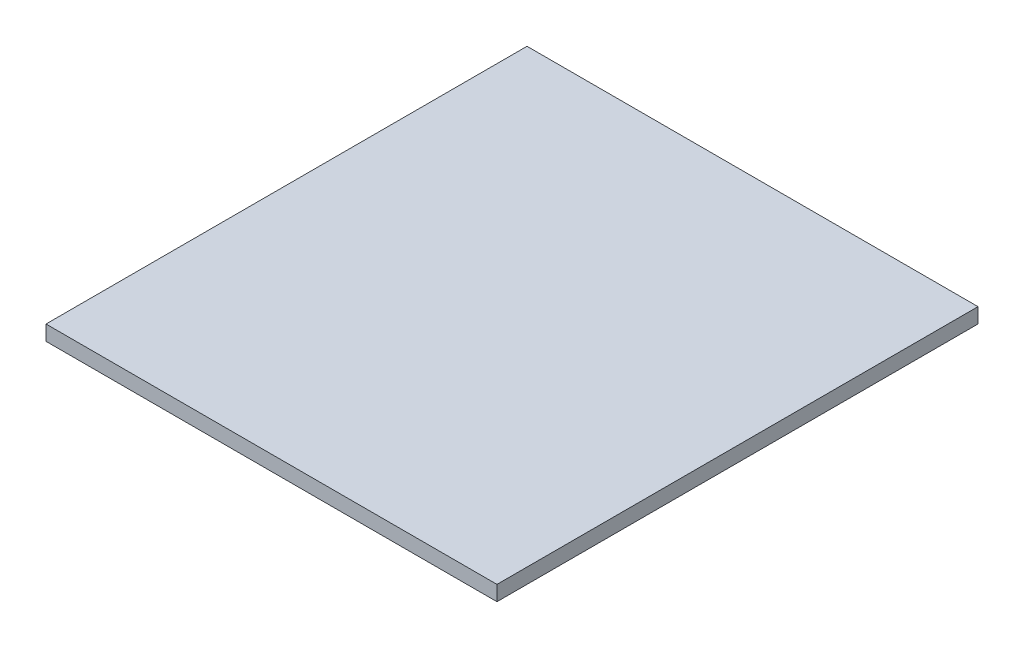
ISO-10303-21;
HEADER;
FILE_DESCRIPTION(('STEP AP214'),'2;1');
FILE_NAME('part.step','',(''),(''),'','','');
FILE_SCHEMA(('AUTOMOTIVE_DESIGN { 1 0 10303 214 1 1 1 1 }'));
ENDSEC;
DATA;
#1=APPLICATION_CONTEXT('core data for automotive mechanical design processes');
#2=APPLICATION_PROTOCOL_DEFINITION('international standard','automotive_design',2000,#1);
#3=PRODUCT_CONTEXT('',#1,'mechanical');
#4=PRODUCT('Part','Part','',(#3));
#5=PRODUCT_RELATED_PRODUCT_CATEGORY('part','',(#4));
#6=PRODUCT_DEFINITION_FORMATION('','',#4);
#7=PRODUCT_DEFINITION_CONTEXT('part definition',#1,'design');
#8=PRODUCT_DEFINITION('design','',#6,#7);
#9=PRODUCT_DEFINITION_SHAPE('','',#8);
#10=(LENGTH_UNIT() NAMED_UNIT(*) SI_UNIT(.MILLI.,.METRE.));
#11=(NAMED_UNIT(*) PLANE_ANGLE_UNIT() SI_UNIT($,.RADIAN.));
#12=(NAMED_UNIT(*) SI_UNIT($,.STERADIAN.) SOLID_ANGLE_UNIT());
#13=UNCERTAINTY_MEASURE_WITH_UNIT(LENGTH_MEASURE(1.E-05),#10,'distance_accuracy_value','');
#14=(GEOMETRIC_REPRESENTATION_CONTEXT(3) GLOBAL_UNCERTAINTY_ASSIGNED_CONTEXT((#13)) GLOBAL_UNIT_ASSIGNED_CONTEXT((#10,
#11,#12)) REPRESENTATION_CONTEXT('',''));
#15=CARTESIAN_POINT('',(0.,0.,0.));
#16=DIRECTION('',(0.,0.,1.));
#17=DIRECTION('',(1.,0.,0.));
#18=AXIS2_PLACEMENT_3D('',#15,#16,#17);
#19=CARTESIAN_POINT('',(0.,0.,0.));
#20=DIRECTION('',(0.,1.,0.));
#21=DIRECTION('',(0.,0.,1.));
#22=AXIS2_PLACEMENT_3D('',#19,#20,#21);
#23=PLANE('',#22);
#24=DIRECTION('',(0.,0.,-1.));
#25=VECTOR('',#24,1.);
#26=CARTESIAN_POINT('',(158.75,0.,-165.1));
#27=LINE('',#26,#25);
#28=CARTESIAN_POINT('',(158.75,0.,165.1));
#29=VERTEX_POINT('',#28);
#30=CARTESIAN_POINT('',(158.75,0.,-165.1));
#31=VERTEX_POINT('',#30);
#32=EDGE_CURVE('E140',#29,#31,#27,.T.);
#33=ORIENTED_EDGE('',*,*,#32,.F.);
#34=DIRECTION('',(1.,0.,0.));
#35=VECTOR('',#34,1.);
#36=CARTESIAN_POINT('',(-158.75,0.,165.1));
#37=LINE('',#36,#35);
#38=CARTESIAN_POINT('',(-158.75,0.,165.1));
#39=VERTEX_POINT('',#38);
#40=EDGE_CURVE('E142',#39,#29,#37,.T.);
#41=ORIENTED_EDGE('',*,*,#40,.F.);
#42=DIRECTION('',(0.,0.,1.));
#43=VECTOR('',#42,1.);
#44=CARTESIAN_POINT('',(-158.75,0.,-165.1));
#45=LINE('',#44,#43);
#46=CARTESIAN_POINT('',(-158.75,0.,-165.1));
#47=VERTEX_POINT('',#46);
#48=EDGE_CURVE('E231',#47,#39,#45,.T.);
#49=ORIENTED_EDGE('',*,*,#48,.F.);
#50=DIRECTION('',(-1.,0.,0.));
#51=VECTOR('',#50,1.);
#52=CARTESIAN_POINT('',(-158.75,0.,-165.1));
#53=LINE('',#52,#51);
#54=EDGE_CURVE('E183',#31,#47,#53,.T.);
#55=ORIENTED_EDGE('',*,*,#54,.F.);
#56=EDGE_LOOP('',(#33,#41,#49,#55));
#57=FACE_BOUND('',#56,.T.);
#58=ADVANCED_FACE('F46',(#57),#23,.F.);
#59=CARTESIAN_POINT('',(152.644230769231,-30.5288461538462,0.));
#60=DIRECTION('',(-0.98058067569092,0.196116135138184,0.));
#61=DIRECTION('',(-0.196116135138184,-0.98058067569092,0.));
#62=AXIS2_PLACEMENT_3D('',#59,#60,#61);
#63=PLANE('',#62);
#64=DIRECTION('',(0.179424521606502,0.897122608032512,-0.403705173614634));
#65=VECTOR('',#64,1.);
#66=CARTESIAN_POINT('',(158.75,0.,-165.1));
#67=LINE('',#66,#65);
#68=CARTESIAN_POINT('',(163.83,25.4,-176.53));
#69=VERTEX_POINT('',#68);
#70=EDGE_CURVE('E63',#31,#69,#67,.T.);
#71=ORIENTED_EDGE('',*,*,#70,.T.);
#72=DIRECTION('',(0.,0.,-1.));
#73=VECTOR('',#72,1.);
#74=CARTESIAN_POINT('',(163.83,25.4,-176.53));
#75=LINE('',#74,#73);
#76=CARTESIAN_POINT('',(163.83,25.4,176.53));
#77=VERTEX_POINT('',#76);
#78=EDGE_CURVE('E285',#77,#69,#75,.T.);
#79=ORIENTED_EDGE('',*,*,#78,.F.);
#80=DIRECTION('',(0.179424521606504,0.897122608032514,0.403705173614628));
#81=VECTOR('',#80,1.);
#82=CARTESIAN_POINT('',(158.75,0.,165.1));
#83=LINE('',#82,#81);
#84=EDGE_CURVE('E292',#29,#77,#83,.T.);
#85=ORIENTED_EDGE('',*,*,#84,.F.);
#86=ORIENTED_EDGE('',*,*,#32,.T.);
#87=EDGE_LOOP('',(#71,#79,#85,#86));
#88=FACE_BOUND('',#87,.T.);
#89=ADVANCED_FACE('F249',(#88),#63,.F.);
#90=CARTESIAN_POINT('',(0.,-61.7837837837835,137.297297297298));
#91=DIRECTION('',(0.,0.410364677328795,-0.911921505175108));
#92=DIRECTION('',(0.,0.911921505175108,0.410364677328795));
#93=AXIS2_PLACEMENT_3D('',#90,#91,#92);
#94=PLANE('',#93);
#95=ORIENTED_EDGE('',*,*,#84,.T.);
#96=DIRECTION('',(1.,0.,0.));
#97=VECTOR('',#96,1.);
#98=CARTESIAN_POINT('',(-163.83,25.4,176.53));
#99=LINE('',#98,#97);
#100=CARTESIAN_POINT('',(-163.83,25.4,176.53));
#101=VERTEX_POINT('',#100);
#102=EDGE_CURVE('E152',#101,#77,#99,.T.);
#103=ORIENTED_EDGE('',*,*,#102,.F.);
#104=DIRECTION('',(-0.179424521606502,0.897122608032514,0.403705173614628));
#105=VECTOR('',#104,1.);
#106=CARTESIAN_POINT('',(-158.75,0.,165.1));
#107=LINE('',#106,#105);
#108=EDGE_CURVE('E288',#39,#101,#107,.T.);
#109=ORIENTED_EDGE('',*,*,#108,.F.);
#110=ORIENTED_EDGE('',*,*,#40,.T.);
#111=EDGE_LOOP('',(#95,#103,#109,#110));
#112=FACE_BOUND('',#111,.T.);
#113=ADVANCED_FACE('F198',(#112),#94,.F.);
#114=CARTESIAN_POINT('',(0.,-61.7837837837841,-137.297297297297));
#115=DIRECTION('',(0.,0.410364677328801,0.911921505175105));
#116=DIRECTION('',(0.,-0.911921505175105,0.410364677328801));
#117=AXIS2_PLACEMENT_3D('',#114,#115,#116);
#118=PLANE('',#117);
#119=DIRECTION('',(-0.179424521606502,0.897122608032512,-0.403705173614634));
#120=VECTOR('',#119,1.);
#121=CARTESIAN_POINT('',(-158.75,0.,-165.1));
#122=LINE('',#121,#120);
#123=CARTESIAN_POINT('',(-163.83,25.4,-176.53));
#124=VERTEX_POINT('',#123);
#125=EDGE_CURVE('E290',#47,#124,#122,.T.);
#126=ORIENTED_EDGE('',*,*,#125,.T.);
#127=DIRECTION('',(-1.,0.,0.));
#128=VECTOR('',#127,1.);
#129=CARTESIAN_POINT('',(-163.83,25.4,-176.53));
#130=LINE('',#129,#128);
#131=EDGE_CURVE('E12',#69,#124,#130,.T.);
#132=ORIENTED_EDGE('',*,*,#131,.F.);
#133=ORIENTED_EDGE('',*,*,#70,.F.);
#134=ORIENTED_EDGE('',*,*,#54,.T.);
#135=EDGE_LOOP('',(#126,#132,#133,#134));
#136=FACE_BOUND('',#135,.T.);
#137=ADVANCED_FACE('F189',(#136),#118,.F.);
#138=CARTESIAN_POINT('',(-152.644230769231,-30.528846153846,0.));
#139=DIRECTION('',(0.98058067569092,0.196116135138183,0.));
#140=DIRECTION('',(-0.196116135138183,0.98058067569092,0.));
#141=AXIS2_PLACEMENT_3D('',#138,#139,#140);
#142=PLANE('',#141);
#143=ORIENTED_EDGE('',*,*,#108,.T.);
#144=DIRECTION('',(0.,0.,1.));
#145=VECTOR('',#144,1.);
#146=CARTESIAN_POINT('',(-163.83,25.4,-176.53));
#147=LINE('',#146,#145);
#148=EDGE_CURVE('E56',#124,#101,#147,.T.);
#149=ORIENTED_EDGE('',*,*,#148,.F.);
#150=ORIENTED_EDGE('',*,*,#125,.F.);
#151=ORIENTED_EDGE('',*,*,#48,.T.);
#152=EDGE_LOOP('',(#143,#149,#150,#151));
#153=FACE_BOUND('',#152,.T.);
#154=ADVANCED_FACE('F48',(#153),#142,.F.);
#155=CARTESIAN_POINT('',(0.,25.4,0.));
#156=DIRECTION('',(0.,1.,0.));
#157=DIRECTION('',(0.,0.,1.));
#158=AXIS2_PLACEMENT_3D('',#155,#156,#157);
#159=PLANE('',#158);
#160=DIRECTION('',(0.,0.,-1.));
#161=VECTOR('',#160,1.);
#162=CARTESIAN_POINT('',(190.5,25.4,-203.2));
#163=LINE('',#162,#161);
#164=CARTESIAN_POINT('',(190.5,25.4,203.2));
#165=VERTEX_POINT('',#164);
#166=CARTESIAN_POINT('',(190.5,25.4,-203.2));
#167=VERTEX_POINT('',#166);
#168=EDGE_CURVE('E139',#165,#167,#163,.T.);
#169=ORIENTED_EDGE('',*,*,#168,.F.);
#170=DIRECTION('',(1.,0.,0.));
#171=VECTOR('',#170,1.);
#172=CARTESIAN_POINT('',(-190.5,25.4,203.2));
#173=LINE('',#172,#171);
#174=CARTESIAN_POINT('',(-190.5,25.4,203.2));
#175=VERTEX_POINT('',#174);
#176=EDGE_CURVE('E135',#175,#165,#173,.T.);
#177=ORIENTED_EDGE('',*,*,#176,.F.);
#178=DIRECTION('',(0.,0.,1.));
#179=VECTOR('',#178,1.);
#180=CARTESIAN_POINT('',(-190.5,25.4,-203.2));
#181=LINE('',#180,#179);
#182=CARTESIAN_POINT('',(-190.5,25.4,-203.2));
#183=VERTEX_POINT('',#182);
#184=EDGE_CURVE('E404',#183,#175,#181,.T.);
#185=ORIENTED_EDGE('',*,*,#184,.F.);
#186=DIRECTION('',(-1.,0.,0.));
#187=VECTOR('',#186,1.);
#188=CARTESIAN_POINT('',(-190.5,25.4,-203.2));
#189=LINE('',#188,#187);
#190=EDGE_CURVE('E407',#167,#183,#189,.T.);
#191=ORIENTED_EDGE('',*,*,#190,.F.);
#192=EDGE_LOOP('',(#169,#177,#185,#191));
#193=FACE_BOUND('',#192,.T.);
#194=ORIENTED_EDGE('',*,*,#102,.T.);
#195=ORIENTED_EDGE('',*,*,#78,.T.);
#196=ORIENTED_EDGE('',*,*,#131,.T.);
#197=ORIENTED_EDGE('',*,*,#148,.T.);
#198=EDGE_LOOP('',(#194,#195,#196,#197));
#199=FACE_BOUND('',#198,.T.);
#200=ADVANCED_FACE('F158',(#193,#199),#159,.F.);
#201=CARTESIAN_POINT('',(190.5,38.1,-203.2));
#202=DIRECTION('',(-1.,0.,0.));
#203=DIRECTION('',(0.,0.,1.));
#204=AXIS2_PLACEMENT_3D('',#201,#202,#203);
#205=PLANE('',#204);
#206=ORIENTED_EDGE('',*,*,#168,.T.);
#207=DIRECTION('',(0.,-1.,0.));
#208=VECTOR('',#207,1.);
#209=CARTESIAN_POINT('',(190.5,38.1,-203.2));
#210=LINE('',#209,#208);
#211=CARTESIAN_POINT('',(190.5,38.1,-203.2));
#212=VERTEX_POINT('',#211);
#213=EDGE_CURVE('E119',#212,#167,#210,.T.);
#214=ORIENTED_EDGE('',*,*,#213,.F.);
#215=DIRECTION('',(0.,0.,-1.));
#216=VECTOR('',#215,1.);
#217=CARTESIAN_POINT('',(190.5,38.1,-203.2));
#218=LINE('',#217,#216);
#219=CARTESIAN_POINT('',(190.5,38.1,203.2));
#220=VERTEX_POINT('',#219);
#221=EDGE_CURVE('E126',#220,#212,#218,.T.);
#222=ORIENTED_EDGE('',*,*,#221,.F.);
#223=DIRECTION('',(0.,-1.,0.));
#224=VECTOR('',#223,1.);
#225=CARTESIAN_POINT('',(190.5,38.1,203.2));
#226=LINE('',#225,#224);
#227=EDGE_CURVE('E401',#220,#165,#226,.T.);
#228=ORIENTED_EDGE('',*,*,#227,.T.);
#229=EDGE_LOOP('',(#206,#214,#222,#228));
#230=FACE_BOUND('',#229,.T.);
#231=ADVANCED_FACE('F137',(#230),#205,.F.);
#232=CARTESIAN_POINT('',(-190.5,38.1,-203.2));
#233=DIRECTION('',(0.,0.,1.));
#234=DIRECTION('',(1.,0.,0.));
#235=AXIS2_PLACEMENT_3D('',#232,#233,#234);
#236=PLANE('',#235);
#237=ORIENTED_EDGE('',*,*,#190,.T.);
#238=DIRECTION('',(0.,-1.,0.));
#239=VECTOR('',#238,1.);
#240=CARTESIAN_POINT('',(-190.5,38.1,-203.2));
#241=LINE('',#240,#239);
#242=CARTESIAN_POINT('',(-190.5,38.1,-203.2));
#243=VERTEX_POINT('',#242);
#244=EDGE_CURVE('E122',#243,#183,#241,.T.);
#245=ORIENTED_EDGE('',*,*,#244,.F.);
#246=DIRECTION('',(-1.,0.,0.));
#247=VECTOR('',#246,1.);
#248=CARTESIAN_POINT('',(-190.5,38.1,-203.2));
#249=LINE('',#248,#247);
#250=EDGE_CURVE('E115',#212,#243,#249,.T.);
#251=ORIENTED_EDGE('',*,*,#250,.F.);
#252=ORIENTED_EDGE('',*,*,#213,.T.);
#253=EDGE_LOOP('',(#237,#245,#251,#252));
#254=FACE_BOUND('',#253,.T.);
#255=ADVANCED_FACE('F117',(#254),#236,.F.);
#256=CARTESIAN_POINT('',(-190.5,38.1,-203.2));
#257=DIRECTION('',(1.,0.,0.));
#258=DIRECTION('',(0.,0.,-1.));
#259=AXIS2_PLACEMENT_3D('',#256,#257,#258);
#260=PLANE('',#259);
#261=ORIENTED_EDGE('',*,*,#184,.T.);
#262=DIRECTION('',(0.,-1.,0.));
#263=VECTOR('',#262,1.);
#264=CARTESIAN_POINT('',(-190.5,38.1,203.2));
#265=LINE('',#264,#263);
#266=CARTESIAN_POINT('',(-190.5,38.1,203.2));
#267=VERTEX_POINT('',#266);
#268=EDGE_CURVE('E144',#267,#175,#265,.T.);
#269=ORIENTED_EDGE('',*,*,#268,.F.);
#270=DIRECTION('',(0.,0.,1.));
#271=VECTOR('',#270,1.);
#272=CARTESIAN_POINT('',(-190.5,38.1,-203.2));
#273=LINE('',#272,#271);
#274=EDGE_CURVE('E125',#243,#267,#273,.T.);
#275=ORIENTED_EDGE('',*,*,#274,.F.);
#276=ORIENTED_EDGE('',*,*,#244,.T.);
#277=EDGE_LOOP('',(#261,#269,#275,#276));
#278=FACE_BOUND('',#277,.T.);
#279=ADVANCED_FACE('F370',(#278),#260,.F.);
#280=CARTESIAN_POINT('',(-190.5,38.1,203.2));
#281=DIRECTION('',(0.,0.,-1.));
#282=DIRECTION('',(-1.,0.,0.));
#283=AXIS2_PLACEMENT_3D('',#280,#281,#282);
#284=PLANE('',#283);
#285=ORIENTED_EDGE('',*,*,#176,.T.);
#286=ORIENTED_EDGE('',*,*,#227,.F.);
#287=DIRECTION('',(1.,0.,0.));
#288=VECTOR('',#287,1.);
#289=CARTESIAN_POINT('',(-190.5,38.1,203.2));
#290=LINE('',#289,#288);
#291=EDGE_CURVE('E131',#267,#220,#290,.T.);
#292=ORIENTED_EDGE('',*,*,#291,.F.);
#293=ORIENTED_EDGE('',*,*,#268,.T.);
#294=EDGE_LOOP('',(#285,#286,#292,#293));
#295=FACE_BOUND('',#294,.T.);
#296=ADVANCED_FACE('F169',(#295),#284,.F.);
#297=CARTESIAN_POINT('',(0.,38.1,0.));
#298=DIRECTION('',(0.,1.,0.));
#299=DIRECTION('',(0.,0.,1.));
#300=AXIS2_PLACEMENT_3D('',#297,#298,#299);
#301=PLANE('',#300);
#302=ORIENTED_EDGE('',*,*,#221,.T.);
#303=ORIENTED_EDGE('',*,*,#250,.T.);
#304=ORIENTED_EDGE('',*,*,#274,.T.);
#305=ORIENTED_EDGE('',*,*,#291,.T.);
#306=EDGE_LOOP('',(#302,#303,#304,#305));
#307=FACE_BOUND('',#306,.T.);
#308=ADVANCED_FACE('F129',(#307),#301,.T.);
#309=CLOSED_SHELL('',(#58,#89,#113,#137,#154,#200,#231,#255,#279,#296,#308));
#310=MANIFOLD_SOLID_BREP('B2',#309);
#311=ADVANCED_BREP_SHAPE_REPRESENTATION('',(#18,#310),#14);
#312=SHAPE_DEFINITION_REPRESENTATION(#9,#311);
ENDSEC;
END-ISO-10303-21;
